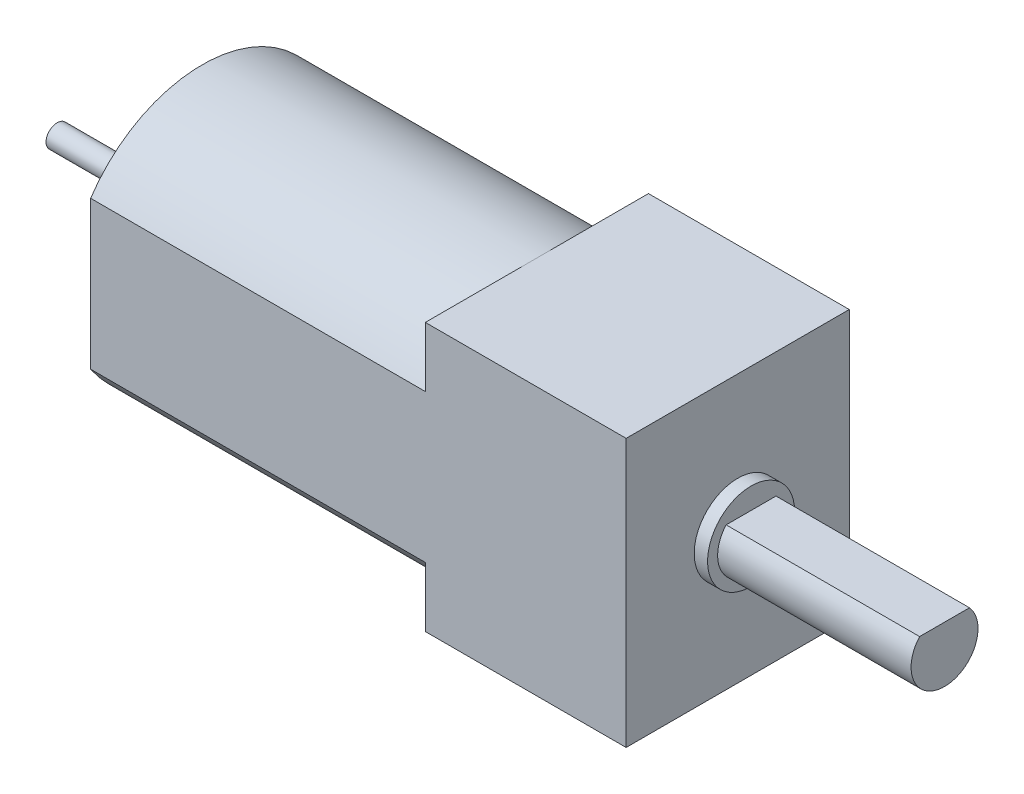
ISO-10303-21;
HEADER;
FILE_DESCRIPTION(('STEP AP214'),'2;1');
FILE_NAME('part.step','',(''),(''),'','','');
FILE_SCHEMA(('AUTOMOTIVE_DESIGN { 1 0 10303 214 1 1 1 1 }'));
ENDSEC;
DATA;
#1=APPLICATION_CONTEXT('core data for automotive mechanical design processes');
#2=APPLICATION_PROTOCOL_DEFINITION('international standard','automotive_design',2000,#1);
#3=PRODUCT_CONTEXT('',#1,'mechanical');
#4=PRODUCT('Part','Part','',(#3));
#5=PRODUCT_RELATED_PRODUCT_CATEGORY('part','',(#4));
#6=PRODUCT_DEFINITION_FORMATION('','',#4);
#7=PRODUCT_DEFINITION_CONTEXT('part definition',#1,'design');
#8=PRODUCT_DEFINITION('design','',#6,#7);
#9=PRODUCT_DEFINITION_SHAPE('','',#8);
#10=(LENGTH_UNIT() NAMED_UNIT(*) SI_UNIT(.MILLI.,.METRE.));
#11=(NAMED_UNIT(*) PLANE_ANGLE_UNIT() SI_UNIT($,.RADIAN.));
#12=(NAMED_UNIT(*) SI_UNIT($,.STERADIAN.) SOLID_ANGLE_UNIT());
#13=UNCERTAINTY_MEASURE_WITH_UNIT(LENGTH_MEASURE(1.E-05),#10,'distance_accuracy_value','');
#14=(GEOMETRIC_REPRESENTATION_CONTEXT(3) GLOBAL_UNCERTAINTY_ASSIGNED_CONTEXT((#13)) GLOBAL_UNIT_ASSIGNED_CONTEXT((#10,
#11,#12)) REPRESENTATION_CONTEXT('',''));
#15=CARTESIAN_POINT('',(0.,0.,0.));
#16=DIRECTION('',(0.,0.,1.));
#17=DIRECTION('',(1.,0.,0.));
#18=AXIS2_PLACEMENT_3D('',#15,#16,#17);
#19=CARTESIAN_POINT('',(-2.,0.,0.));
#20=DIRECTION('',(-1.,0.,0.));
#21=DIRECTION('',(0.,0.,1.));
#22=AXIS2_PLACEMENT_3D('',#19,#20,#21);
#23=PLANE('',#22);
#24=CARTESIAN_POINT('',(-2.,0.,0.));
#25=DIRECTION('',(-1.,0.,0.));
#26=DIRECTION('',(0.,0.,1.));
#27=AXIS2_PLACEMENT_3D('',#24,#25,#26);
#28=CIRCLE('',#27,2.5);
#29=CARTESIAN_POINT('',(-2.,0.,2.5));
#30=VERTEX_POINT('',#29);
#31=EDGE_CURVE('E247',#30,#30,#28,.T.);
#32=ORIENTED_EDGE('',*,*,#31,.T.);
#33=EDGE_LOOP('',(#32));
#34=FACE_BOUND('',#33,.T.);
#35=CARTESIAN_POINT('',(-2.,0.,0.));
#36=DIRECTION('',(-1.,0.,0.));
#37=DIRECTION('',(0.,0.,1.));
#38=AXIS2_PLACEMENT_3D('',#35,#36,#37);
#39=CIRCLE('',#38,0.5);
#40=CARTESIAN_POINT('',(-2.,0.,0.5));
#41=VERTEX_POINT('',#40);
#42=EDGE_CURVE('E434',#41,#41,#39,.T.);
#43=ORIENTED_EDGE('',*,*,#42,.F.);
#44=EDGE_LOOP('',(#43));
#45=FACE_BOUND('',#44,.T.);
#46=ADVANCED_FACE('F33',(#34,#45),#23,.T.);
#47=CARTESIAN_POINT('',(24.6,0.,0.));
#48=DIRECTION('',(1.,0.,0.));
#49=DIRECTION('',(0.,0.,-1.));
#50=AXIS2_PLACEMENT_3D('',#47,#48,#49);
#51=PLANE('',#50);
#52=CARTESIAN_POINT('',(24.6,0.,0.));
#53=DIRECTION('',(1.,0.,0.));
#54=DIRECTION('',(0.,0.,-1.));
#55=AXIS2_PLACEMENT_3D('',#52,#53,#54);
#56=CIRCLE('',#55,1.95);
#57=CARTESIAN_POINT('',(24.6,0.,-1.95));
#58=VERTEX_POINT('',#57);
#59=EDGE_CURVE('E139',#58,#58,#56,.T.);
#60=ORIENTED_EDGE('',*,*,#59,.T.);
#61=EDGE_LOOP('',(#60));
#62=FACE_BOUND('',#61,.T.);
#63=CARTESIAN_POINT('',(24.6,0.,0.));
#64=DIRECTION('',(1.,0.,0.));
#65=DIRECTION('',(0.,0.,-1.));
#66=AXIS2_PLACEMENT_3D('',#63,#64,#65);
#67=CIRCLE('',#66,1.5);
#68=CARTESIAN_POINT('',(24.6,1.,1.1180339887499));
#69=VERTEX_POINT('',#68);
#70=CARTESIAN_POINT('',(24.6,1.,-1.1180339887499));
#71=VERTEX_POINT('',#70);
#72=EDGE_CURVE('E132',#69,#71,#67,.T.);
#73=ORIENTED_EDGE('',*,*,#72,.F.);
#74=DIRECTION('',(0.,0.,1.));
#75=VECTOR('',#74,1.);
#76=CARTESIAN_POINT('',(24.6,1.,1.1180339887499));
#77=LINE('',#76,#75);
#78=EDGE_CURVE('E133',#71,#69,#77,.T.);
#79=ORIENTED_EDGE('',*,*,#78,.F.);
#80=EDGE_LOOP('',(#73,#79));
#81=FACE_BOUND('',#80,.T.);
#82=ADVANCED_FACE('F266',(#62,#81),#51,.T.);
#83=CARTESIAN_POINT('',(24.,0.,0.));
#84=DIRECTION('',(1.,0.,0.));
#85=DIRECTION('',(0.,0.,-1.));
#86=AXIS2_PLACEMENT_3D('',#83,#84,#85);
#87=PLANE('',#86);
#88=DIRECTION('',(0.,-1.,0.));
#89=VECTOR('',#88,1.);
#90=CARTESIAN_POINT('',(24.,6.,5.));
#91=LINE('',#90,#89);
#92=CARTESIAN_POINT('',(24.,6.,5.));
#93=VERTEX_POINT('',#92);
#94=CARTESIAN_POINT('',(24.,-6.,5.));
#95=VERTEX_POINT('',#94);
#96=EDGE_CURVE('E148',#93,#95,#91,.T.);
#97=ORIENTED_EDGE('',*,*,#96,.T.);
#98=DIRECTION('',(0.,0.,-1.));
#99=VECTOR('',#98,1.);
#100=CARTESIAN_POINT('',(24.,-6.,5.));
#101=LINE('',#100,#99);
#102=CARTESIAN_POINT('',(24.,-6.,-5.));
#103=VERTEX_POINT('',#102);
#104=EDGE_CURVE('E151',#95,#103,#101,.T.);
#105=ORIENTED_EDGE('',*,*,#104,.T.);
#106=DIRECTION('',(0.,1.,0.));
#107=VECTOR('',#106,1.);
#108=CARTESIAN_POINT('',(24.,6.,-5.));
#109=LINE('',#108,#107);
#110=CARTESIAN_POINT('',(24.,6.,-5.));
#111=VERTEX_POINT('',#110);
#112=EDGE_CURVE('E154',#103,#111,#109,.T.);
#113=ORIENTED_EDGE('',*,*,#112,.T.);
#114=DIRECTION('',(0.,0.,1.));
#115=VECTOR('',#114,1.);
#116=CARTESIAN_POINT('',(24.,6.,5.));
#117=LINE('',#116,#115);
#118=EDGE_CURVE('E156',#111,#93,#117,.T.);
#119=ORIENTED_EDGE('',*,*,#118,.T.);
#120=EDGE_LOOP('',(#97,#105,#113,#119));
#121=FACE_BOUND('',#120,.T.);
#122=CARTESIAN_POINT('',(24.,0.,0.));
#123=DIRECTION('',(1.,0.,0.));
#124=DIRECTION('',(0.,0.,-1.));
#125=AXIS2_PLACEMENT_3D('',#122,#123,#124);
#126=CIRCLE('',#125,1.95);
#127=CARTESIAN_POINT('',(24.,0.,-1.95));
#128=VERTEX_POINT('',#127);
#129=EDGE_CURVE('E136',#128,#128,#126,.T.);
#130=ORIENTED_EDGE('',*,*,#129,.F.);
#131=EDGE_LOOP('',(#130));
#132=FACE_BOUND('',#131,.T.);
#133=ADVANCED_FACE('F258',(#121,#132),#87,.T.);
#134=CARTESIAN_POINT('',(0.,0.,0.));
#135=DIRECTION('',(-1.,0.,0.));
#136=DIRECTION('',(0.,0.,1.));
#137=AXIS2_PLACEMENT_3D('',#134,#135,#136);
#138=PLANE('',#137);
#139=CARTESIAN_POINT('',(0.,0.,0.));
#140=DIRECTION('',(1.,0.,0.));
#141=DIRECTION('',(0.,0.,1.));
#142=AXIS2_PLACEMENT_3D('',#139,#140,#141);
#143=CIRCLE('',#142,6.);
#144=CARTESIAN_POINT('',(0.,3.3166247903554,-5.));
#145=VERTEX_POINT('',#144);
#146=CARTESIAN_POINT('',(0.,3.3166247903554,5.));
#147=VERTEX_POINT('',#146);
#148=EDGE_CURVE('E223',#145,#147,#143,.T.);
#149=ORIENTED_EDGE('',*,*,#148,.F.);
#150=DIRECTION('',(0.,1.,0.));
#151=VECTOR('',#150,1.);
#152=CARTESIAN_POINT('',(0.,3.3166247903554,-5.));
#153=LINE('',#152,#151);
#154=CARTESIAN_POINT('',(0.,-3.3166247903554,-5.));
#155=VERTEX_POINT('',#154);
#156=EDGE_CURVE('E229',#155,#145,#153,.T.);
#157=ORIENTED_EDGE('',*,*,#156,.F.);
#158=CARTESIAN_POINT('',(0.,0.,0.));
#159=DIRECTION('',(1.,0.,0.));
#160=DIRECTION('',(0.,0.,-1.));
#161=AXIS2_PLACEMENT_3D('',#158,#159,#160);
#162=CIRCLE('',#161,6.);
#163=CARTESIAN_POINT('',(0.,-3.3166247903554,5.));
#164=VERTEX_POINT('',#163);
#165=EDGE_CURVE('E244',#164,#155,#162,.T.);
#166=ORIENTED_EDGE('',*,*,#165,.F.);
#167=DIRECTION('',(0.,-1.,0.));
#168=VECTOR('',#167,1.);
#169=CARTESIAN_POINT('',(0.,3.3166247903554,5.));
#170=LINE('',#169,#168);
#171=EDGE_CURVE('E245',#147,#164,#170,.T.);
#172=ORIENTED_EDGE('',*,*,#171,.F.);
#173=EDGE_LOOP('',(#149,#157,#166,#172));
#174=FACE_BOUND('',#173,.T.);
#175=CARTESIAN_POINT('',(0.,0.,0.));
#176=DIRECTION('',(-1.,0.,0.));
#177=DIRECTION('',(0.,0.,1.));
#178=AXIS2_PLACEMENT_3D('',#175,#176,#177);
#179=CIRCLE('',#178,2.5);
#180=CARTESIAN_POINT('',(0.,0.,2.5));
#181=VERTEX_POINT('',#180);
#182=EDGE_CURVE('E174',#181,#181,#179,.T.);
#183=ORIENTED_EDGE('',*,*,#182,.F.);
#184=EDGE_LOOP('',(#183));
#185=FACE_BOUND('',#184,.T.);
#186=ADVANCED_FACE('F256',(#174,#185),#138,.T.);
#187=CARTESIAN_POINT('',(15.,0.,0.));
#188=DIRECTION('',(-1.,0.,0.));
#189=DIRECTION('',(0.,0.,1.));
#190=AXIS2_PLACEMENT_3D('',#187,#188,#189);
#191=CYLINDRICAL_SURFACE('',#190,6.);
#192=ORIENTED_EDGE('',*,*,#148,.T.);
#193=DIRECTION('',(-1.,0.,0.));
#194=VECTOR('',#193,1.);
#195=CARTESIAN_POINT('',(15.,3.3166247903554,5.));
#196=LINE('',#195,#194);
#197=CARTESIAN_POINT('',(15.,3.3166247903554,5.));
#198=VERTEX_POINT('',#197);
#199=EDGE_CURVE('E11',#198,#147,#196,.T.);
#200=ORIENTED_EDGE('',*,*,#199,.F.);
#201=CARTESIAN_POINT('',(15.,0.,0.));
#202=DIRECTION('',(1.,0.,0.));
#203=DIRECTION('',(0.,0.,1.));
#204=AXIS2_PLACEMENT_3D('',#201,#202,#203);
#205=CIRCLE('',#204,6.);
#206=CARTESIAN_POINT('',(15.,6.,0.));
#207=VERTEX_POINT('',#206);
#208=EDGE_CURVE('E212',#207,#198,#205,.T.);
#209=ORIENTED_EDGE('',*,*,#208,.F.);
#210=CARTESIAN_POINT('',(15.,3.3166247903554,-5.));
#211=VERTEX_POINT('',#210);
#212=EDGE_CURVE('E37',#211,#207,#205,.T.);
#213=ORIENTED_EDGE('',*,*,#212,.F.);
#214=DIRECTION('',(-1.,0.,0.));
#215=VECTOR('',#214,1.);
#216=CARTESIAN_POINT('',(15.,3.3166247903554,-5.));
#217=LINE('',#216,#215);
#218=EDGE_CURVE('E209',#211,#145,#217,.T.);
#219=ORIENTED_EDGE('',*,*,#218,.T.);
#220=EDGE_LOOP('',(#192,#200,#209,#213,#219));
#221=FACE_BOUND('',#220,.T.);
#222=ADVANCED_FACE('F35',(#221),#191,.T.);
#223=CARTESIAN_POINT('',(15.,3.3166247903554,5.));
#224=DIRECTION('',(0.,0.,-1.));
#225=DIRECTION('',(-1.,0.,0.));
#226=AXIS2_PLACEMENT_3D('',#223,#224,#225);
#227=PLANE('',#226);
#228=ORIENTED_EDGE('',*,*,#171,.T.);
#229=DIRECTION('',(-1.,0.,0.));
#230=VECTOR('',#229,1.);
#231=CARTESIAN_POINT('',(15.,-3.3166247903554,5.));
#232=LINE('',#231,#230);
#233=CARTESIAN_POINT('',(15.,-3.3166247903554,5.));
#234=VERTEX_POINT('',#233);
#235=EDGE_CURVE('E43',#234,#164,#232,.T.);
#236=ORIENTED_EDGE('',*,*,#235,.F.);
#237=DIRECTION('',(0.,-1.,0.));
#238=VECTOR('',#237,1.);
#239=CARTESIAN_POINT('',(15.,6.,5.));
#240=LINE('',#239,#238);
#241=CARTESIAN_POINT('',(15.,-6.,5.));
#242=VERTEX_POINT('',#241);
#243=EDGE_CURVE('E146',#234,#242,#240,.T.);
#244=ORIENTED_EDGE('',*,*,#243,.T.);
#245=DIRECTION('',(-1.,0.,0.));
#246=VECTOR('',#245,1.);
#247=CARTESIAN_POINT('',(24.,-6.,5.));
#248=LINE('',#247,#246);
#249=EDGE_CURVE('E171',#95,#242,#248,.T.);
#250=ORIENTED_EDGE('',*,*,#249,.F.);
#251=ORIENTED_EDGE('',*,*,#96,.F.);
#252=DIRECTION('',(-1.,0.,0.));
#253=VECTOR('',#252,1.);
#254=CARTESIAN_POINT('',(24.,6.,5.));
#255=LINE('',#254,#253);
#256=CARTESIAN_POINT('',(15.,6.,5.));
#257=VERTEX_POINT('',#256);
#258=EDGE_CURVE('E158',#93,#257,#255,.T.);
#259=ORIENTED_EDGE('',*,*,#258,.T.);
#260=EDGE_CURVE('E167',#257,#198,#240,.T.);
#261=ORIENTED_EDGE('',*,*,#260,.T.);
#262=ORIENTED_EDGE('',*,*,#199,.T.);
#263=EDGE_LOOP('',(#228,#236,#244,#250,#251,#259,#261,#262));
#264=FACE_BOUND('',#263,.T.);
#265=ADVANCED_FACE('F265',(#264),#227,.F.);
#266=CARTESIAN_POINT('',(15.,0.,0.));
#267=DIRECTION('',(-1.,0.,0.));
#268=DIRECTION('',(0.,0.,1.));
#269=AXIS2_PLACEMENT_3D('',#266,#267,#268);
#270=CYLINDRICAL_SURFACE('',#269,6.);
#271=ORIENTED_EDGE('',*,*,#165,.T.);
#272=DIRECTION('',(-1.,0.,0.));
#273=VECTOR('',#272,1.);
#274=CARTESIAN_POINT('',(15.,-3.3166247903554,-5.));
#275=LINE('',#274,#273);
#276=CARTESIAN_POINT('',(15.,-3.3166247903554,-5.));
#277=VERTEX_POINT('',#276);
#278=EDGE_CURVE('E234',#277,#155,#275,.T.);
#279=ORIENTED_EDGE('',*,*,#278,.F.);
#280=CARTESIAN_POINT('',(15.,0.,0.));
#281=DIRECTION('',(1.,0.,0.));
#282=DIRECTION('',(0.,0.,-1.));
#283=AXIS2_PLACEMENT_3D('',#280,#281,#282);
#284=CIRCLE('',#283,6.);
#285=CARTESIAN_POINT('',(15.,-6.,0.));
#286=VERTEX_POINT('',#285);
#287=EDGE_CURVE('E59',#286,#277,#284,.T.);
#288=ORIENTED_EDGE('',*,*,#287,.F.);
#289=EDGE_CURVE('E207',#234,#286,#284,.T.);
#290=ORIENTED_EDGE('',*,*,#289,.F.);
#291=ORIENTED_EDGE('',*,*,#235,.T.);
#292=EDGE_LOOP('',(#271,#279,#288,#290,#291));
#293=FACE_BOUND('',#292,.T.);
#294=ADVANCED_FACE('F291',(#293),#270,.T.);
#295=CARTESIAN_POINT('',(15.,3.3166247903554,-5.));
#296=DIRECTION('',(0.,0.,1.));
#297=DIRECTION('',(1.,0.,0.));
#298=AXIS2_PLACEMENT_3D('',#295,#296,#297);
#299=PLANE('',#298);
#300=ORIENTED_EDGE('',*,*,#156,.T.);
#301=ORIENTED_EDGE('',*,*,#218,.F.);
#302=DIRECTION('',(0.,1.,0.));
#303=VECTOR('',#302,1.);
#304=CARTESIAN_POINT('',(15.,6.,-5.));
#305=LINE('',#304,#303);
#306=CARTESIAN_POINT('',(15.,6.,-5.));
#307=VERTEX_POINT('',#306);
#308=EDGE_CURVE('E188',#211,#307,#305,.T.);
#309=ORIENTED_EDGE('',*,*,#308,.T.);
#310=DIRECTION('',(-1.,0.,0.));
#311=VECTOR('',#310,1.);
#312=CARTESIAN_POINT('',(24.,6.,-5.));
#313=LINE('',#312,#311);
#314=EDGE_CURVE('E178',#111,#307,#313,.T.);
#315=ORIENTED_EDGE('',*,*,#314,.F.);
#316=ORIENTED_EDGE('',*,*,#112,.F.);
#317=DIRECTION('',(-1.,0.,0.));
#318=VECTOR('',#317,1.);
#319=CARTESIAN_POINT('',(24.,-6.,-5.));
#320=LINE('',#319,#318);
#321=CARTESIAN_POINT('',(15.,-6.,-5.));
#322=VERTEX_POINT('',#321);
#323=EDGE_CURVE('E175',#103,#322,#320,.T.);
#324=ORIENTED_EDGE('',*,*,#323,.T.);
#325=EDGE_CURVE('E190',#322,#277,#305,.T.);
#326=ORIENTED_EDGE('',*,*,#325,.T.);
#327=ORIENTED_EDGE('',*,*,#278,.T.);
#328=EDGE_LOOP('',(#300,#301,#309,#315,#316,#324,#326,#327));
#329=FACE_BOUND('',#328,.T.);
#330=ADVANCED_FACE('F205',(#329),#299,.F.);
#331=CARTESIAN_POINT('',(-2.,0.,0.));
#332=DIRECTION('',(1.,0.,0.));
#333=DIRECTION('',(0.,0.,-1.));
#334=AXIS2_PLACEMENT_3D('',#331,#332,#333);
#335=CYLINDRICAL_SURFACE('',#334,2.5);
#336=ORIENTED_EDGE('',*,*,#31,.F.);
#337=EDGE_LOOP('',(#336));
#338=FACE_BOUND('',#337,.T.);
#339=ORIENTED_EDGE('',*,*,#182,.T.);
#340=EDGE_LOOP('',(#339));
#341=FACE_BOUND('',#340,.T.);
#342=ADVANCED_FACE('F254',(#338,#341),#335,.T.);
#343=CARTESIAN_POINT('',(15.,0.,0.));
#344=DIRECTION('',(1.,0.,0.));
#345=DIRECTION('',(0.,0.,-1.));
#346=AXIS2_PLACEMENT_3D('',#343,#344,#345);
#347=PLANE('',#346);
#348=ORIENTED_EDGE('',*,*,#308,.F.);
#349=ORIENTED_EDGE('',*,*,#212,.T.);
#350=DIRECTION('',(0.,0.,1.));
#351=VECTOR('',#350,1.);
#352=CARTESIAN_POINT('',(15.,6.,5.));
#353=LINE('',#352,#351);
#354=EDGE_CURVE('E152',#307,#207,#353,.T.);
#355=ORIENTED_EDGE('',*,*,#354,.F.);
#356=EDGE_LOOP('',(#348,#349,#355));
#357=FACE_BOUND('',#356,.T.);
#358=ADVANCED_FACE('F282',(#357),#347,.F.);
#359=EDGE_CURVE('E184',#207,#257,#353,.T.);
#360=ORIENTED_EDGE('',*,*,#359,.F.);
#361=ORIENTED_EDGE('',*,*,#208,.T.);
#362=ORIENTED_EDGE('',*,*,#260,.F.);
#363=EDGE_LOOP('',(#360,#361,#362));
#364=FACE_BOUND('',#363,.T.);
#365=ADVANCED_FACE('F288',(#364),#347,.F.);
#366=ORIENTED_EDGE('',*,*,#243,.F.);
#367=ORIENTED_EDGE('',*,*,#289,.T.);
#368=DIRECTION('',(0.,0.,-1.));
#369=VECTOR('',#368,1.);
#370=CARTESIAN_POINT('',(15.,-6.,5.));
#371=LINE('',#370,#369);
#372=EDGE_CURVE('E161',#242,#286,#371,.T.);
#373=ORIENTED_EDGE('',*,*,#372,.F.);
#374=EDGE_LOOP('',(#366,#367,#373));
#375=FACE_BOUND('',#374,.T.);
#376=ADVANCED_FACE('F326',(#375),#347,.F.);
#377=EDGE_CURVE('E170',#286,#322,#371,.T.);
#378=ORIENTED_EDGE('',*,*,#377,.F.);
#379=ORIENTED_EDGE('',*,*,#287,.T.);
#380=ORIENTED_EDGE('',*,*,#325,.F.);
#381=EDGE_LOOP('',(#378,#379,#380));
#382=FACE_BOUND('',#381,.T.);
#383=ADVANCED_FACE('F206',(#382),#347,.F.);
#384=CARTESIAN_POINT('',(24.,-6.,5.));
#385=DIRECTION('',(0.,1.,0.));
#386=DIRECTION('',(0.,0.,1.));
#387=AXIS2_PLACEMENT_3D('',#384,#385,#386);
#388=PLANE('',#387);
#389=ORIENTED_EDGE('',*,*,#372,.T.);
#390=ORIENTED_EDGE('',*,*,#377,.T.);
#391=ORIENTED_EDGE('',*,*,#323,.F.);
#392=ORIENTED_EDGE('',*,*,#104,.F.);
#393=ORIENTED_EDGE('',*,*,#249,.T.);
#394=EDGE_LOOP('',(#389,#390,#391,#392,#393));
#395=FACE_BOUND('',#394,.T.);
#396=ADVANCED_FACE('F202',(#395),#388,.F.);
#397=CARTESIAN_POINT('',(24.,6.,5.));
#398=DIRECTION('',(0.,-1.,0.));
#399=DIRECTION('',(0.,0.,-1.));
#400=AXIS2_PLACEMENT_3D('',#397,#398,#399);
#401=PLANE('',#400);
#402=ORIENTED_EDGE('',*,*,#354,.T.);
#403=ORIENTED_EDGE('',*,*,#359,.T.);
#404=ORIENTED_EDGE('',*,*,#258,.F.);
#405=ORIENTED_EDGE('',*,*,#118,.F.);
#406=ORIENTED_EDGE('',*,*,#314,.T.);
#407=EDGE_LOOP('',(#402,#403,#404,#405,#406));
#408=FACE_BOUND('',#407,.T.);
#409=ADVANCED_FACE('F350',(#408),#401,.F.);
#410=CARTESIAN_POINT('',(24.6,0.,0.));
#411=DIRECTION('',(-1.,0.,0.));
#412=DIRECTION('',(0.,0.,1.));
#413=AXIS2_PLACEMENT_3D('',#410,#411,#412);
#414=CYLINDRICAL_SURFACE('',#413,1.95);
#415=ORIENTED_EDGE('',*,*,#59,.F.);
#416=EDGE_LOOP('',(#415));
#417=FACE_BOUND('',#416,.T.);
#418=ORIENTED_EDGE('',*,*,#129,.T.);
#419=EDGE_LOOP('',(#418));
#420=FACE_BOUND('',#419,.T.);
#421=ADVANCED_FACE('F358',(#417,#420),#414,.T.);
#422=CARTESIAN_POINT('',(33.27,0.,0.));
#423=DIRECTION('',(-1.,0.,0.));
#424=DIRECTION('',(0.,0.,1.));
#425=AXIS2_PLACEMENT_3D('',#422,#423,#424);
#426=CYLINDRICAL_SURFACE('',#425,1.5);
#427=CARTESIAN_POINT('',(33.27,0.,0.));
#428=DIRECTION('',(1.,0.,0.));
#429=DIRECTION('',(0.,0.,-1.));
#430=AXIS2_PLACEMENT_3D('',#427,#428,#429);
#431=CIRCLE('',#430,1.5);
#432=CARTESIAN_POINT('',(33.27,1.,1.1180339887499));
#433=VERTEX_POINT('',#432);
#434=CARTESIAN_POINT('',(33.27,1.,-1.1180339887499));
#435=VERTEX_POINT('',#434);
#436=EDGE_CURVE('E130',#433,#435,#431,.T.);
#437=ORIENTED_EDGE('',*,*,#436,.F.);
#438=DIRECTION('',(1.,0.,0.));
#439=VECTOR('',#438,1.);
#440=CARTESIAN_POINT('',(22.3087121525221,1.,1.1180339887499));
#441=LINE('',#440,#439);
#442=EDGE_CURVE('E51',#69,#433,#441,.T.);
#443=ORIENTED_EDGE('',*,*,#442,.F.);
#444=ORIENTED_EDGE('',*,*,#72,.T.);
#445=DIRECTION('',(1.,0.,0.));
#446=VECTOR('',#445,1.);
#447=CARTESIAN_POINT('',(22.3087121525221,1.,-1.1180339887499));
#448=LINE('',#447,#446);
#449=EDGE_CURVE('E120',#71,#435,#448,.T.);
#450=ORIENTED_EDGE('',*,*,#449,.T.);
#451=EDGE_LOOP('',(#437,#443,#444,#450));
#452=FACE_BOUND('',#451,.T.);
#453=ADVANCED_FACE('F129',(#452),#426,.T.);
#454=CARTESIAN_POINT('',(33.27,0.,0.));
#455=DIRECTION('',(1.,0.,0.));
#456=DIRECTION('',(0.,0.,-1.));
#457=AXIS2_PLACEMENT_3D('',#454,#455,#456);
#458=PLANE('',#457);
#459=DIRECTION('',(0.,0.,-1.));
#460=VECTOR('',#459,1.);
#461=CARTESIAN_POINT('',(33.27,1.,1.1180339887499));
#462=LINE('',#461,#460);
#463=EDGE_CURVE('E117',#433,#435,#462,.T.);
#464=ORIENTED_EDGE('',*,*,#463,.F.);
#465=ORIENTED_EDGE('',*,*,#436,.T.);
#466=EDGE_LOOP('',(#464,#465));
#467=FACE_BOUND('',#466,.T.);
#468=ADVANCED_FACE('F135',(#467),#458,.T.);
#469=CARTESIAN_POINT('',(22.3087121525221,1.,1.1180339887499));
#470=DIRECTION('',(0.,-1.,0.));
#471=DIRECTION('',(0.,0.,-1.));
#472=AXIS2_PLACEMENT_3D('',#469,#470,#471);
#473=PLANE('',#472);
#474=ORIENTED_EDGE('',*,*,#78,.T.);
#475=ORIENTED_EDGE('',*,*,#442,.T.);
#476=ORIENTED_EDGE('',*,*,#463,.T.);
#477=ORIENTED_EDGE('',*,*,#449,.F.);
#478=EDGE_LOOP('',(#474,#475,#476,#477));
#479=FACE_BOUND('',#478,.T.);
#480=ADVANCED_FACE('F119',(#479),#473,.F.);
#481=CARTESIAN_POINT('',(-6.5,0.,0.));
#482=DIRECTION('',(1.,0.,0.));
#483=DIRECTION('',(0.,0.,-1.));
#484=AXIS2_PLACEMENT_3D('',#481,#482,#483);
#485=CYLINDRICAL_SURFACE('',#484,0.5);
#486=CARTESIAN_POINT('',(-6.5,0.,0.));
#487=DIRECTION('',(-1.,0.,0.));
#488=DIRECTION('',(0.,0.,1.));
#489=AXIS2_PLACEMENT_3D('',#486,#487,#488);
#490=CIRCLE('',#489,0.5);
#491=CARTESIAN_POINT('',(-6.5,0.,0.5));
#492=VERTEX_POINT('',#491);
#493=EDGE_CURVE('E125',#492,#492,#490,.T.);
#494=ORIENTED_EDGE('',*,*,#493,.F.);
#495=EDGE_LOOP('',(#494));
#496=FACE_BOUND('',#495,.T.);
#497=ORIENTED_EDGE('',*,*,#42,.T.);
#498=EDGE_LOOP('',(#497));
#499=FACE_BOUND('',#498,.T.);
#500=ADVANCED_FACE('F404',(#496,#499),#485,.T.);
#501=CARTESIAN_POINT('',(-6.5,0.,0.));
#502=DIRECTION('',(-1.,0.,0.));
#503=DIRECTION('',(0.,0.,1.));
#504=AXIS2_PLACEMENT_3D('',#501,#502,#503);
#505=PLANE('',#504);
#506=ORIENTED_EDGE('',*,*,#493,.T.);
#507=EDGE_LOOP('',(#506));
#508=FACE_BOUND('',#507,.T.);
#509=ADVANCED_FACE('F418',(#508),#505,.T.);
#510=CLOSED_SHELL('',(#46,#82,#133,#186,#222,#265,#294,#330,#342,#358,#365,#376,#383,#396,#409,
#421,#453,#468,#480,#500,#509));
#511=MANIFOLD_SOLID_BREP('B2',#510);
#512=ADVANCED_BREP_SHAPE_REPRESENTATION('',(#18,#511),#14);
#513=SHAPE_DEFINITION_REPRESENTATION(#9,#512);
ENDSEC;
END-ISO-10303-21;
